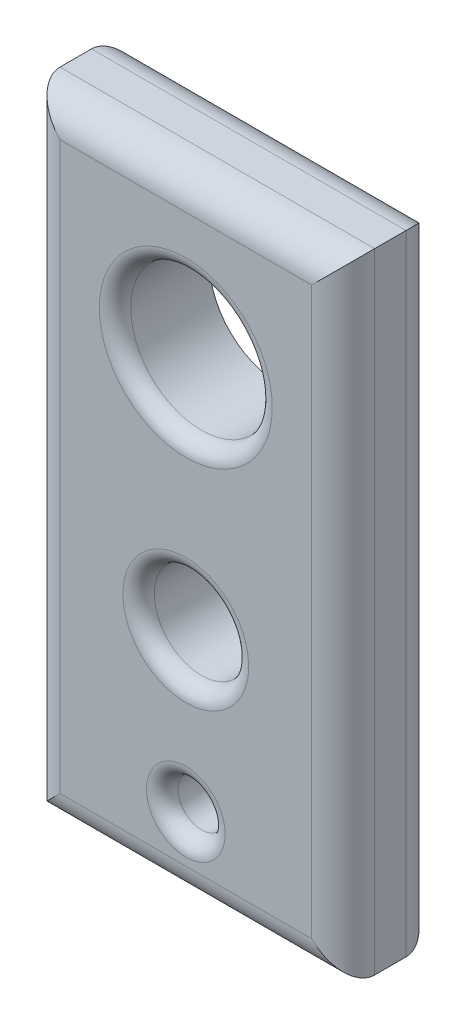
ISO-10303-21;
HEADER;
FILE_DESCRIPTION(('STEP AP214'),'2;1');
FILE_NAME('part.step','',(''),(''),'','','');
FILE_SCHEMA(('AUTOMOTIVE_DESIGN { 1 0 10303 214 1 1 1 1 }'));
ENDSEC;
DATA;
#1=APPLICATION_CONTEXT('core data for automotive mechanical design processes');
#2=APPLICATION_PROTOCOL_DEFINITION('international standard','automotive_design',2000,#1);
#3=PRODUCT_CONTEXT('',#1,'mechanical');
#4=PRODUCT('Part','Part','',(#3));
#5=PRODUCT_RELATED_PRODUCT_CATEGORY('part','',(#4));
#6=PRODUCT_DEFINITION_FORMATION('','',#4);
#7=PRODUCT_DEFINITION_CONTEXT('part definition',#1,'design');
#8=PRODUCT_DEFINITION('design','',#6,#7);
#9=PRODUCT_DEFINITION_SHAPE('','',#8);
#10=(LENGTH_UNIT() NAMED_UNIT(*) SI_UNIT(.MILLI.,.METRE.));
#11=(NAMED_UNIT(*) PLANE_ANGLE_UNIT() SI_UNIT($,.RADIAN.));
#12=(NAMED_UNIT(*) SI_UNIT($,.STERADIAN.) SOLID_ANGLE_UNIT());
#13=UNCERTAINTY_MEASURE_WITH_UNIT(LENGTH_MEASURE(1.E-05),#10,'distance_accuracy_value','');
#14=(GEOMETRIC_REPRESENTATION_CONTEXT(3) GLOBAL_UNCERTAINTY_ASSIGNED_CONTEXT((#13)) GLOBAL_UNIT_ASSIGNED_CONTEXT((#10,
#11,#12)) REPRESENTATION_CONTEXT('',''));
#15=CARTESIAN_POINT('',(0.,0.,0.));
#16=DIRECTION('',(0.,0.,1.));
#17=DIRECTION('',(1.,0.,0.));
#18=AXIS2_PLACEMENT_3D('',#15,#16,#17);
#19=CARTESIAN_POINT('',(0.,0.,762.));
#20=DIRECTION('',(1.,0.,0.));
#21=DIRECTION('',(0.,1.,0.));
#22=AXIS2_PLACEMENT_3D('',#19,#20,#21);
#23=PLANE('',#22);
#24=DIRECTION('',(0.,0.,-1.));
#25=VECTOR('',#24,1.);
#26=CARTESIAN_POINT('',(-1.33226762955019E-12,5080.,762.));
#27=LINE('',#26,#25);
#28=CARTESIAN_POINT('',(-1.33226762955019E-12,5080.,508.));
#29=VERTEX_POINT('',#28);
#30=CARTESIAN_POINT('',(-1.33226762955019E-12,5080.,254.));
#31=VERTEX_POINT('',#30);
#32=EDGE_CURVE('E173',#29,#31,#27,.T.);
#33=ORIENTED_EDGE('',*,*,#32,.T.);
#34=DIRECTION('',(0.,-1.,0.));
#35=VECTOR('',#34,1.);
#36=CARTESIAN_POINT('',(0.,0.,254.));
#37=LINE('',#36,#35);
#38=CARTESIAN_POINT('',(0.,0.,254.));
#39=VERTEX_POINT('',#38);
#40=EDGE_CURVE('E154',#31,#39,#37,.T.);
#41=ORIENTED_EDGE('',*,*,#40,.T.);
#42=DIRECTION('',(0.,0.,-1.));
#43=VECTOR('',#42,1.);
#44=CARTESIAN_POINT('',(0.,0.,762.));
#45=LINE('',#44,#43);
#46=CARTESIAN_POINT('',(0.,0.,508.));
#47=VERTEX_POINT('',#46);
#48=EDGE_CURVE('E123',#47,#39,#45,.T.);
#49=ORIENTED_EDGE('',*,*,#48,.F.);
#50=DIRECTION('',(0.,-1.,0.));
#51=VECTOR('',#50,1.);
#52=CARTESIAN_POINT('',(0.,0.,508.));
#53=LINE('',#52,#51);
#54=EDGE_CURVE('E151',#47,#29,#53,.F.);
#55=ORIENTED_EDGE('',*,*,#54,.T.);
#56=EDGE_LOOP('',(#33,#41,#49,#55));
#57=FACE_BOUND('',#56,.T.);
#58=ADVANCED_FACE('F33',(#57),#23,.F.);
#59=CARTESIAN_POINT('',(0.,0.,762.));
#60=DIRECTION('',(0.,1.,0.));
#61=DIRECTION('',(0.,0.,1.));
#62=AXIS2_PLACEMENT_3D('',#59,#60,#61);
#63=PLANE('',#62);
#64=ORIENTED_EDGE('',*,*,#48,.T.);
#65=DIRECTION('',(1.,0.,0.));
#66=VECTOR('',#65,1.);
#67=CARTESIAN_POINT('',(2540.,0.,254.));
#68=LINE('',#67,#66);
#69=CARTESIAN_POINT('',(2540.,0.,254.));
#70=VERTEX_POINT('',#69);
#71=EDGE_CURVE('E122',#39,#70,#68,.T.);
#72=ORIENTED_EDGE('',*,*,#71,.T.);
#73=DIRECTION('',(0.,0.,-1.));
#74=VECTOR('',#73,1.);
#75=CARTESIAN_POINT('',(2540.,0.,762.));
#76=LINE('',#75,#74);
#77=CARTESIAN_POINT('',(2540.,0.,508.));
#78=VERTEX_POINT('',#77);
#79=EDGE_CURVE('E104',#78,#70,#76,.T.);
#80=ORIENTED_EDGE('',*,*,#79,.F.);
#81=DIRECTION('',(1.,0.,0.));
#82=VECTOR('',#81,1.);
#83=CARTESIAN_POINT('',(0.,0.,508.));
#84=LINE('',#83,#82);
#85=EDGE_CURVE('E119',#78,#47,#84,.F.);
#86=ORIENTED_EDGE('',*,*,#85,.T.);
#87=EDGE_LOOP('',(#64,#72,#80,#86));
#88=FACE_BOUND('',#87,.T.);
#89=ADVANCED_FACE('F117',(#88),#63,.F.);
#90=CARTESIAN_POINT('',(2540.,0.,762.));
#91=DIRECTION('',(-1.,0.,0.));
#92=DIRECTION('',(0.,-1.,0.));
#93=AXIS2_PLACEMENT_3D('',#90,#91,#92);
#94=PLANE('',#93);
#95=ORIENTED_EDGE('',*,*,#79,.T.);
#96=DIRECTION('',(0.,1.,0.));
#97=VECTOR('',#96,1.);
#98=CARTESIAN_POINT('',(2540.,5080.,254.));
#99=LINE('',#98,#97);
#100=CARTESIAN_POINT('',(2540.,5080.,254.));
#101=VERTEX_POINT('',#100);
#102=EDGE_CURVE('E111',#70,#101,#99,.T.);
#103=ORIENTED_EDGE('',*,*,#102,.T.);
#104=DIRECTION('',(0.,0.,-1.));
#105=VECTOR('',#104,1.);
#106=CARTESIAN_POINT('',(2540.,5080.,762.));
#107=LINE('',#106,#105);
#108=CARTESIAN_POINT('',(2540.,5080.,508.));
#109=VERTEX_POINT('',#108);
#110=EDGE_CURVE('E106',#109,#101,#107,.T.);
#111=ORIENTED_EDGE('',*,*,#110,.F.);
#112=DIRECTION('',(0.,1.,0.));
#113=VECTOR('',#112,1.);
#114=CARTESIAN_POINT('',(2540.,0.,508.));
#115=LINE('',#114,#113);
#116=EDGE_CURVE('E101',#109,#78,#115,.F.);
#117=ORIENTED_EDGE('',*,*,#116,.T.);
#118=EDGE_LOOP('',(#95,#103,#111,#117));
#119=FACE_BOUND('',#118,.T.);
#120=ADVANCED_FACE('F103',(#119),#94,.F.);
#121=CARTESIAN_POINT('',(-1.33226762955019E-12,5080.,762.));
#122=DIRECTION('',(0.,-1.,0.));
#123=DIRECTION('',(0.,0.,-1.));
#124=AXIS2_PLACEMENT_3D('',#121,#122,#123);
#125=PLANE('',#124);
#126=ORIENTED_EDGE('',*,*,#110,.T.);
#127=DIRECTION('',(-1.,0.,0.));
#128=VECTOR('',#127,1.);
#129=CARTESIAN_POINT('',(-1.33226762955019E-12,5080.,254.));
#130=LINE('',#129,#128);
#131=EDGE_CURVE('E149',#101,#31,#130,.T.);
#132=ORIENTED_EDGE('',*,*,#131,.T.);
#133=ORIENTED_EDGE('',*,*,#32,.F.);
#134=DIRECTION('',(-1.,0.,0.));
#135=VECTOR('',#134,1.);
#136=CARTESIAN_POINT('',(-1.33226762955019E-12,5080.,508.));
#137=LINE('',#136,#135);
#138=EDGE_CURVE('E147',#29,#109,#137,.F.);
#139=ORIENTED_EDGE('',*,*,#138,.T.);
#140=EDGE_LOOP('',(#126,#132,#133,#139));
#141=FACE_BOUND('',#140,.T.);
#142=ADVANCED_FACE('F311',(#141),#125,.F.);
#143=CARTESIAN_POINT('',(0.,0.,762.));
#144=DIRECTION('',(0.,0.,-1.));
#145=DIRECTION('',(-1.,0.,0.));
#146=AXIS2_PLACEMENT_3D('',#143,#144,#145);
#147=PLANE('',#146);
#148=CARTESIAN_POINT('',(1270.,635.,762.));
#149=DIRECTION('',(0.,0.,-1.));
#150=DIRECTION('',(-1.,0.,0.));
#151=AXIS2_PLACEMENT_3D('',#148,#149,#150);
#152=CIRCLE('',#151,317.5);
#153=CARTESIAN_POINT('',(952.5,635.,762.));
#154=VERTEX_POINT('',#153);
#155=EDGE_CURVE('E186',#154,#154,#152,.T.);
#156=ORIENTED_EDGE('',*,*,#155,.T.);
#157=EDGE_LOOP('',(#156));
#158=FACE_BOUND('',#157,.T.);
#159=CARTESIAN_POINT('',(1270.,1905.,762.));
#160=DIRECTION('',(0.,0.,-1.));
#161=DIRECTION('',(-1.,0.,0.));
#162=AXIS2_PLACEMENT_3D('',#159,#160,#161);
#163=CIRCLE('',#162,508.);
#164=CARTESIAN_POINT('',(762.,1905.,762.));
#165=VERTEX_POINT('',#164);
#166=EDGE_CURVE('E183',#165,#165,#163,.T.);
#167=ORIENTED_EDGE('',*,*,#166,.T.);
#168=EDGE_LOOP('',(#167));
#169=FACE_BOUND('',#168,.T.);
#170=CARTESIAN_POINT('',(1270.,3810.,762.));
#171=DIRECTION('',(0.,0.,-1.));
#172=DIRECTION('',(-1.,0.,0.));
#173=AXIS2_PLACEMENT_3D('',#170,#171,#172);
#174=CIRCLE('',#173,698.5);
#175=CARTESIAN_POINT('',(571.5,3810.,762.));
#176=VERTEX_POINT('',#175);
#177=EDGE_CURVE('E180',#176,#176,#174,.T.);
#178=ORIENTED_EDGE('',*,*,#177,.T.);
#179=EDGE_LOOP('',(#178));
#180=FACE_BOUND('',#179,.T.);
#181=DIRECTION('',(-1.,0.,0.));
#182=VECTOR('',#181,1.);
#183=CARTESIAN_POINT('',(0.,4826.,762.));
#184=LINE('',#183,#182);
#185=CARTESIAN_POINT('',(2286.,4826.,762.));
#186=VERTEX_POINT('',#185);
#187=CARTESIAN_POINT('',(253.999999999999,4826.,762.));
#188=VERTEX_POINT('',#187);
#189=EDGE_CURVE('E156',#186,#188,#184,.T.);
#190=ORIENTED_EDGE('',*,*,#189,.T.);
#191=DIRECTION('',(0.,-1.,0.));
#192=VECTOR('',#191,1.);
#193=CARTESIAN_POINT('',(254.,0.,762.));
#194=LINE('',#193,#192);
#195=CARTESIAN_POINT('',(254.,254.,762.));
#196=VERTEX_POINT('',#195);
#197=EDGE_CURVE('E160',#188,#196,#194,.T.);
#198=ORIENTED_EDGE('',*,*,#197,.T.);
#199=DIRECTION('',(1.,0.,0.));
#200=VECTOR('',#199,1.);
#201=CARTESIAN_POINT('',(0.,254.,762.));
#202=LINE('',#201,#200);
#203=CARTESIAN_POINT('',(2286.,254.,762.));
#204=VERTEX_POINT('',#203);
#205=EDGE_CURVE('E55',#196,#204,#202,.T.);
#206=ORIENTED_EDGE('',*,*,#205,.T.);
#207=DIRECTION('',(0.,1.,0.));
#208=VECTOR('',#207,1.);
#209=CARTESIAN_POINT('',(2286.,5.99520433297585E-13,762.));
#210=LINE('',#209,#208);
#211=EDGE_CURVE('E128',#204,#186,#210,.T.);
#212=ORIENTED_EDGE('',*,*,#211,.T.);
#213=EDGE_LOOP('',(#190,#198,#206,#212));
#214=FACE_BOUND('',#213,.T.);
#215=ADVANCED_FACE('F309',(#158,#169,#180,#214),#147,.F.);
#216=CARTESIAN_POINT('',(0.,0.,0.));
#217=DIRECTION('',(0.,0.,-1.));
#218=DIRECTION('',(-1.,0.,0.));
#219=AXIS2_PLACEMENT_3D('',#216,#217,#218);
#220=PLANE('',#219);
#221=CARTESIAN_POINT('',(1270.,635.,0.));
#222=DIRECTION('',(0.,0.,1.));
#223=DIRECTION('',(1.,0.,0.));
#224=AXIS2_PLACEMENT_3D('',#221,#222,#223);
#225=CIRCLE('',#224,190.5);
#226=CARTESIAN_POINT('',(1460.5,635.,0.));
#227=VERTEX_POINT('',#226);
#228=EDGE_CURVE('E175',#227,#227,#225,.T.);
#229=ORIENTED_EDGE('',*,*,#228,.T.);
#230=EDGE_LOOP('',(#229));
#231=FACE_BOUND('',#230,.T.);
#232=CARTESIAN_POINT('',(1270.,1905.,0.));
#233=DIRECTION('',(0.,0.,1.));
#234=DIRECTION('',(1.,0.,0.));
#235=AXIS2_PLACEMENT_3D('',#232,#233,#234);
#236=CIRCLE('',#235,381.);
#237=CARTESIAN_POINT('',(1651.,1905.,0.));
#238=VERTEX_POINT('',#237);
#239=EDGE_CURVE('E402',#238,#238,#236,.T.);
#240=ORIENTED_EDGE('',*,*,#239,.T.);
#241=EDGE_LOOP('',(#240));
#242=FACE_BOUND('',#241,.T.);
#243=CARTESIAN_POINT('',(1270.,3810.,0.));
#244=DIRECTION('',(0.,0.,1.));
#245=DIRECTION('',(1.,0.,0.));
#246=AXIS2_PLACEMENT_3D('',#243,#244,#245);
#247=CIRCLE('',#246,571.5);
#248=CARTESIAN_POINT('',(1841.5,3810.,0.));
#249=VERTEX_POINT('',#248);
#250=EDGE_CURVE('E399',#249,#249,#247,.T.);
#251=ORIENTED_EDGE('',*,*,#250,.T.);
#252=EDGE_LOOP('',(#251));
#253=FACE_BOUND('',#252,.T.);
#254=DIRECTION('',(0.,1.,0.));
#255=VECTOR('',#254,1.);
#256=CARTESIAN_POINT('',(2286.,0.,0.));
#257=LINE('',#256,#255);
#258=CARTESIAN_POINT('',(2286.,4826.,0.));
#259=VERTEX_POINT('',#258);
#260=CARTESIAN_POINT('',(2286.,254.,0.));
#261=VERTEX_POINT('',#260);
#262=EDGE_CURVE('E142',#259,#261,#257,.F.);
#263=ORIENTED_EDGE('',*,*,#262,.T.);
#264=DIRECTION('',(1.,0.,0.));
#265=VECTOR('',#264,1.);
#266=CARTESIAN_POINT('',(0.,254.,0.));
#267=LINE('',#266,#265);
#268=CARTESIAN_POINT('',(254.,254.,0.));
#269=VERTEX_POINT('',#268);
#270=EDGE_CURVE('E112',#261,#269,#267,.F.);
#271=ORIENTED_EDGE('',*,*,#270,.T.);
#272=DIRECTION('',(0.,-1.,0.));
#273=VECTOR('',#272,1.);
#274=CARTESIAN_POINT('',(253.999999999999,5080.,0.));
#275=LINE('',#274,#273);
#276=CARTESIAN_POINT('',(253.999999999999,4826.,0.));
#277=VERTEX_POINT('',#276);
#278=EDGE_CURVE('E135',#269,#277,#275,.F.);
#279=ORIENTED_EDGE('',*,*,#278,.T.);
#280=DIRECTION('',(-1.,0.,0.));
#281=VECTOR('',#280,1.);
#282=CARTESIAN_POINT('',(2540.,4826.,0.));
#283=LINE('',#282,#281);
#284=EDGE_CURVE('E140',#277,#259,#283,.F.);
#285=ORIENTED_EDGE('',*,*,#284,.T.);
#286=EDGE_LOOP('',(#263,#271,#279,#285));
#287=FACE_BOUND('',#286,.T.);
#288=ADVANCED_FACE('F232',(#231,#242,#253,#287),#220,.T.);
#289=CARTESIAN_POINT('',(-1.33226762955019E-12,4826.,254.));
#290=DIRECTION('',(1.,0.,0.));
#291=DIRECTION('',(0.,0.,-1.));
#292=AXIS2_PLACEMENT_3D('',#289,#290,#291);
#293=CYLINDRICAL_SURFACE('',#292,254.);
#294=CARTESIAN_POINT('',(2286.,4826.,254.));
#295=DIRECTION('',(0.707106781186548,-0.707106781186547,0.));
#296=DIRECTION('',(0.707106781186547,0.707106781186548,0.));
#297=AXIS2_PLACEMENT_3D('',#294,#295,#296);
#298=ELLIPSE('',#297,359.210244842766,254.);
#299=EDGE_CURVE('E167',#259,#101,#298,.T.);
#300=ORIENTED_EDGE('',*,*,#299,.F.);
#301=ORIENTED_EDGE('',*,*,#284,.F.);
#302=CARTESIAN_POINT('',(253.999999999999,4826.,254.));
#303=DIRECTION('',(0.707106781186547,0.707106781186548,0.));
#304=DIRECTION('',(-0.707106781186548,0.707106781186547,0.));
#305=AXIS2_PLACEMENT_3D('',#302,#303,#304);
#306=ELLIPSE('',#305,359.210244842766,254.);
#307=EDGE_CURVE('E170',#31,#277,#306,.F.);
#308=ORIENTED_EDGE('',*,*,#307,.F.);
#309=ORIENTED_EDGE('',*,*,#131,.F.);
#310=EDGE_LOOP('',(#300,#301,#308,#309));
#311=FACE_BOUND('',#310,.T.);
#312=ADVANCED_FACE('F228',(#311),#293,.T.);
#313=CARTESIAN_POINT('',(254.,0.,254.));
#314=DIRECTION('',(0.,1.,0.));
#315=DIRECTION('',(-1.,0.,0.));
#316=AXIS2_PLACEMENT_3D('',#313,#314,#315);
#317=CYLINDRICAL_SURFACE('',#316,254.);
#318=ORIENTED_EDGE('',*,*,#307,.T.);
#319=ORIENTED_EDGE('',*,*,#278,.F.);
#320=CARTESIAN_POINT('',(254.,254.,254.));
#321=DIRECTION('',(-0.707106781186548,0.707106781186547,0.));
#322=DIRECTION('',(0.707106781186547,0.707106781186548,0.));
#323=AXIS2_PLACEMENT_3D('',#320,#321,#322);
#324=ELLIPSE('',#323,359.210244842766,254.);
#325=EDGE_CURVE('E165',#39,#269,#324,.F.);
#326=ORIENTED_EDGE('',*,*,#325,.F.);
#327=ORIENTED_EDGE('',*,*,#40,.F.);
#328=EDGE_LOOP('',(#318,#319,#326,#327));
#329=FACE_BOUND('',#328,.T.);
#330=ADVANCED_FACE('F224',(#329),#317,.T.);
#331=CARTESIAN_POINT('',(2286.,0.,254.));
#332=DIRECTION('',(0.,-1.,0.));
#333=DIRECTION('',(1.,0.,0.));
#334=AXIS2_PLACEMENT_3D('',#331,#332,#333);
#335=CYLINDRICAL_SURFACE('',#334,254.);
#336=ORIENTED_EDGE('',*,*,#299,.T.);
#337=ORIENTED_EDGE('',*,*,#102,.F.);
#338=CARTESIAN_POINT('',(2286.,254.,254.));
#339=DIRECTION('',(-0.707106781186547,-0.707106781186548,0.));
#340=DIRECTION('',(0.707106781186548,-0.707106781186547,0.));
#341=AXIS2_PLACEMENT_3D('',#338,#339,#340);
#342=ELLIPSE('',#341,359.210244842766,254.);
#343=EDGE_CURVE('E163',#261,#70,#342,.T.);
#344=ORIENTED_EDGE('',*,*,#343,.F.);
#345=ORIENTED_EDGE('',*,*,#262,.F.);
#346=EDGE_LOOP('',(#336,#337,#344,#345));
#347=FACE_BOUND('',#346,.T.);
#348=ADVANCED_FACE('F220',(#347),#335,.T.);
#349=CARTESIAN_POINT('',(0.,254.,254.));
#350=DIRECTION('',(-1.,0.,0.));
#351=DIRECTION('',(0.,0.,1.));
#352=AXIS2_PLACEMENT_3D('',#349,#350,#351);
#353=CYLINDRICAL_SURFACE('',#352,254.);
#354=ORIENTED_EDGE('',*,*,#325,.T.);
#355=ORIENTED_EDGE('',*,*,#270,.F.);
#356=ORIENTED_EDGE('',*,*,#343,.T.);
#357=ORIENTED_EDGE('',*,*,#71,.F.);
#358=EDGE_LOOP('',(#354,#355,#356,#357));
#359=FACE_BOUND('',#358,.T.);
#360=ADVANCED_FACE('F217',(#359),#353,.T.);
#361=CARTESIAN_POINT('',(2286.,5.99520433297585E-13,508.));
#362=DIRECTION('',(0.,1.,0.));
#363=DIRECTION('',(-1.,0.,0.));
#364=AXIS2_PLACEMENT_3D('',#361,#362,#363);
#365=CYLINDRICAL_SURFACE('',#364,254.);
#366=CARTESIAN_POINT('',(2286.,254.,508.));
#367=DIRECTION('',(0.707106781186547,0.707106781186548,0.));
#368=DIRECTION('',(-0.707106781186548,0.707106781186547,0.));
#369=AXIS2_PLACEMENT_3D('',#366,#367,#368);
#370=ELLIPSE('',#369,359.210244842766,254.);
#371=EDGE_CURVE('E126',#78,#204,#370,.F.);
#372=ORIENTED_EDGE('',*,*,#371,.F.);
#373=ORIENTED_EDGE('',*,*,#116,.F.);
#374=CARTESIAN_POINT('',(2286.,4826.,508.));
#375=DIRECTION('',(-0.707106781186548,0.707106781186547,0.));
#376=DIRECTION('',(-0.707106781186547,-0.707106781186548,0.));
#377=AXIS2_PLACEMENT_3D('',#374,#375,#376);
#378=ELLIPSE('',#377,359.210244842766,254.);
#379=EDGE_CURVE('E130',#186,#109,#378,.T.);
#380=ORIENTED_EDGE('',*,*,#379,.F.);
#381=ORIENTED_EDGE('',*,*,#211,.F.);
#382=EDGE_LOOP('',(#372,#373,#380,#381));
#383=FACE_BOUND('',#382,.T.);
#384=ADVANCED_FACE('F127',(#383),#365,.T.);
#385=CARTESIAN_POINT('',(0.,4826.,508.));
#386=DIRECTION('',(-1.,0.,0.));
#387=DIRECTION('',(0.,0.,1.));
#388=AXIS2_PLACEMENT_3D('',#385,#386,#387);
#389=CYLINDRICAL_SURFACE('',#388,254.);
#390=ORIENTED_EDGE('',*,*,#379,.T.);
#391=ORIENTED_EDGE('',*,*,#138,.F.);
#392=CARTESIAN_POINT('',(253.999999999999,4826.,508.));
#393=DIRECTION('',(-0.707106781186547,-0.707106781186548,0.));
#394=DIRECTION('',(-0.707106781186548,0.707106781186547,0.));
#395=AXIS2_PLACEMENT_3D('',#392,#393,#394);
#396=ELLIPSE('',#395,359.210244842766,254.);
#397=EDGE_CURVE('E131',#188,#29,#396,.T.);
#398=ORIENTED_EDGE('',*,*,#397,.F.);
#399=ORIENTED_EDGE('',*,*,#189,.F.);
#400=EDGE_LOOP('',(#390,#391,#398,#399));
#401=FACE_BOUND('',#400,.T.);
#402=ADVANCED_FACE('F240',(#401),#389,.T.);
#403=CARTESIAN_POINT('',(0.,254.,508.));
#404=DIRECTION('',(1.,0.,0.));
#405=DIRECTION('',(0.,0.,-1.));
#406=AXIS2_PLACEMENT_3D('',#403,#404,#405);
#407=CYLINDRICAL_SURFACE('',#406,254.);
#408=ORIENTED_EDGE('',*,*,#371,.T.);
#409=ORIENTED_EDGE('',*,*,#205,.F.);
#410=CARTESIAN_POINT('',(254.,254.,508.));
#411=DIRECTION('',(0.707106781186548,-0.707106781186547,0.));
#412=DIRECTION('',(0.707106781186547,0.707106781186548,0.));
#413=AXIS2_PLACEMENT_3D('',#410,#411,#412);
#414=ELLIPSE('',#413,359.210244842766,254.);
#415=EDGE_CURVE('E48',#47,#196,#414,.F.);
#416=ORIENTED_EDGE('',*,*,#415,.F.);
#417=ORIENTED_EDGE('',*,*,#85,.F.);
#418=EDGE_LOOP('',(#408,#409,#416,#417));
#419=FACE_BOUND('',#418,.T.);
#420=ADVANCED_FACE('F133',(#419),#407,.T.);
#421=CARTESIAN_POINT('',(254.,0.,508.));
#422=DIRECTION('',(0.,-1.,0.));
#423=DIRECTION('',(1.,0.,0.));
#424=AXIS2_PLACEMENT_3D('',#421,#422,#423);
#425=CYLINDRICAL_SURFACE('',#424,254.);
#426=ORIENTED_EDGE('',*,*,#397,.T.);
#427=ORIENTED_EDGE('',*,*,#54,.F.);
#428=ORIENTED_EDGE('',*,*,#415,.T.);
#429=ORIENTED_EDGE('',*,*,#197,.F.);
#430=EDGE_LOOP('',(#426,#427,#428,#429));
#431=FACE_BOUND('',#430,.T.);
#432=ADVANCED_FACE('F234',(#431),#425,.T.);
#433=CARTESIAN_POINT('',(1270.,3810.,0.));
#434=DIRECTION('',(0.,0.,1.));
#435=DIRECTION('',(1.,0.,0.));
#436=AXIS2_PLACEMENT_3D('',#433,#434,#435);
#437=CYLINDRICAL_SURFACE('',#436,571.5);
#438=CARTESIAN_POINT('',(1270.,3810.,635.));
#439=DIRECTION('',(0.,0.,-1.));
#440=DIRECTION('',(-1.,0.,0.));
#441=AXIS2_PLACEMENT_3D('',#438,#439,#440);
#442=CIRCLE('',#441,571.5);
#443=CARTESIAN_POINT('',(698.5,3810.,635.));
#444=VERTEX_POINT('',#443);
#445=EDGE_CURVE('E11',#444,#444,#442,.F.);
#446=ORIENTED_EDGE('',*,*,#445,.T.);
#447=EDGE_LOOP('',(#446));
#448=FACE_BOUND('',#447,.T.);
#449=ORIENTED_EDGE('',*,*,#250,.F.);
#450=EDGE_LOOP('',(#449));
#451=FACE_BOUND('',#450,.T.);
#452=ADVANCED_FACE('F237',(#448,#451),#437,.F.);
#453=CARTESIAN_POINT('',(1270.,1905.,0.));
#454=DIRECTION('',(0.,0.,1.));
#455=DIRECTION('',(1.,0.,0.));
#456=AXIS2_PLACEMENT_3D('',#453,#454,#455);
#457=CYLINDRICAL_SURFACE('',#456,381.);
#458=CARTESIAN_POINT('',(1270.,1905.,635.));
#459=DIRECTION('',(0.,0.,-1.));
#460=DIRECTION('',(-1.,0.,0.));
#461=AXIS2_PLACEMENT_3D('',#458,#459,#460);
#462=CIRCLE('',#461,381.);
#463=CARTESIAN_POINT('',(889.,1905.,635.));
#464=VERTEX_POINT('',#463);
#465=EDGE_CURVE('E41',#464,#464,#462,.F.);
#466=ORIENTED_EDGE('',*,*,#465,.T.);
#467=EDGE_LOOP('',(#466));
#468=FACE_BOUND('',#467,.T.);
#469=ORIENTED_EDGE('',*,*,#239,.F.);
#470=EDGE_LOOP('',(#469));
#471=FACE_BOUND('',#470,.T.);
#472=ADVANCED_FACE('F191',(#468,#471),#457,.F.);
#473=CARTESIAN_POINT('',(1270.,635.,0.));
#474=DIRECTION('',(0.,0.,1.));
#475=DIRECTION('',(1.,0.,0.));
#476=AXIS2_PLACEMENT_3D('',#473,#474,#475);
#477=CYLINDRICAL_SURFACE('',#476,190.5);
#478=CARTESIAN_POINT('',(1270.,635.,635.));
#479=DIRECTION('',(0.,0.,-1.));
#480=DIRECTION('',(-1.,0.,0.));
#481=AXIS2_PLACEMENT_3D('',#478,#479,#480);
#482=CIRCLE('',#481,190.5);
#483=CARTESIAN_POINT('',(1079.5,635.,635.));
#484=VERTEX_POINT('',#483);
#485=EDGE_CURVE('E162',#484,#484,#482,.F.);
#486=ORIENTED_EDGE('',*,*,#485,.T.);
#487=EDGE_LOOP('',(#486));
#488=FACE_BOUND('',#487,.T.);
#489=ORIENTED_EDGE('',*,*,#228,.F.);
#490=EDGE_LOOP('',(#489));
#491=FACE_BOUND('',#490,.T.);
#492=ADVANCED_FACE('F203',(#488,#491),#477,.F.);
#493=CARTESIAN_POINT('',(1270.,635.,635.));
#494=DIRECTION('',(0.,0.,-1.));
#495=DIRECTION('',(-1.,0.,0.));
#496=AXIS2_PLACEMENT_3D('',#493,#494,#495);
#497=TOROIDAL_SURFACE('',#496,317.5,127.);
#498=ORIENTED_EDGE('',*,*,#155,.F.);
#499=EDGE_LOOP('',(#498));
#500=FACE_BOUND('',#499,.T.);
#501=ORIENTED_EDGE('',*,*,#485,.F.);
#502=EDGE_LOOP('',(#501));
#503=FACE_BOUND('',#502,.T.);
#504=ADVANCED_FACE('F196',(#500,#503),#497,.T.);
#505=CARTESIAN_POINT('',(1270.,1905.,635.));
#506=DIRECTION('',(0.,0.,-1.));
#507=DIRECTION('',(-1.,0.,0.));
#508=AXIS2_PLACEMENT_3D('',#505,#506,#507);
#509=TOROIDAL_SURFACE('',#508,508.,127.);
#510=ORIENTED_EDGE('',*,*,#166,.F.);
#511=EDGE_LOOP('',(#510));
#512=FACE_BOUND('',#511,.T.);
#513=ORIENTED_EDGE('',*,*,#465,.F.);
#514=EDGE_LOOP('',(#513));
#515=FACE_BOUND('',#514,.T.);
#516=ADVANCED_FACE('F194',(#512,#515),#509,.T.);
#517=CARTESIAN_POINT('',(1270.,3810.,635.));
#518=DIRECTION('',(0.,0.,-1.));
#519=DIRECTION('',(-1.,0.,0.));
#520=AXIS2_PLACEMENT_3D('',#517,#518,#519);
#521=TOROIDAL_SURFACE('',#520,698.5,127.);
#522=ORIENTED_EDGE('',*,*,#177,.F.);
#523=EDGE_LOOP('',(#522));
#524=FACE_BOUND('',#523,.T.);
#525=ORIENTED_EDGE('',*,*,#445,.F.);
#526=EDGE_LOOP('',(#525));
#527=FACE_BOUND('',#526,.T.);
#528=ADVANCED_FACE('F35',(#524,#527),#521,.T.);
#529=CLOSED_SHELL('',(#58,#89,#120,#142,#215,#288,#312,#330,#348,#360,#384,#402,#420,#432,#452,
#472,#492,#504,#516,#528));
#530=MANIFOLD_SOLID_BREP('B2',#529);
#531=ADVANCED_BREP_SHAPE_REPRESENTATION('',(#18,#530),#14);
#532=SHAPE_DEFINITION_REPRESENTATION(#9,#531);
ENDSEC;
END-ISO-10303-21;
